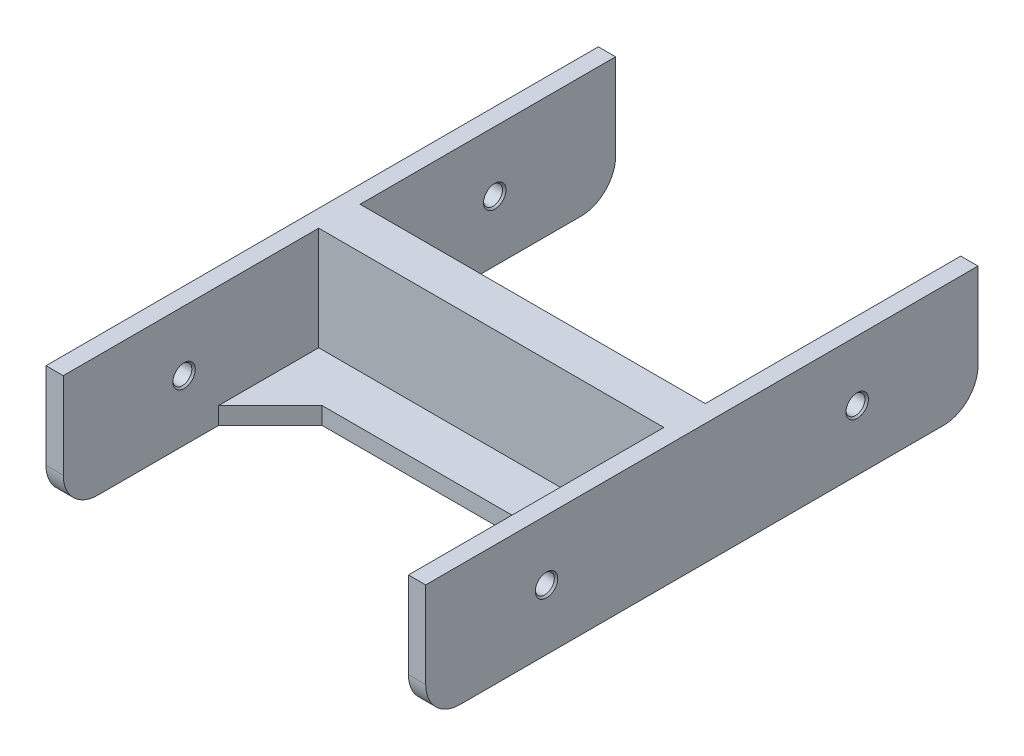
ISO-10303-21;
HEADER;
FILE_DESCRIPTION(('STEP AP214'),'2;1');
FILE_NAME('part.step','',(''),(''),'','','');
FILE_SCHEMA(('AUTOMOTIVE_DESIGN { 1 0 10303 214 1 1 1 1 }'));
ENDSEC;
DATA;
#1=APPLICATION_CONTEXT('core data for automotive mechanical design processes');
#2=APPLICATION_PROTOCOL_DEFINITION('international standard','automotive_design',2000,#1);
#3=PRODUCT_CONTEXT('',#1,'mechanical');
#4=PRODUCT('Part','Part','',(#3));
#5=PRODUCT_RELATED_PRODUCT_CATEGORY('part','',(#4));
#6=PRODUCT_DEFINITION_FORMATION('','',#4);
#7=PRODUCT_DEFINITION_CONTEXT('part definition',#1,'design');
#8=PRODUCT_DEFINITION('design','',#6,#7);
#9=PRODUCT_DEFINITION_SHAPE('','',#8);
#10=(LENGTH_UNIT() NAMED_UNIT(*) SI_UNIT(.MILLI.,.METRE.));
#11=(NAMED_UNIT(*) PLANE_ANGLE_UNIT() SI_UNIT($,.RADIAN.));
#12=(NAMED_UNIT(*) SI_UNIT($,.STERADIAN.) SOLID_ANGLE_UNIT());
#13=UNCERTAINTY_MEASURE_WITH_UNIT(LENGTH_MEASURE(1.E-05),#10,'distance_accuracy_value','');
#14=(GEOMETRIC_REPRESENTATION_CONTEXT(3) GLOBAL_UNCERTAINTY_ASSIGNED_CONTEXT((#13)) GLOBAL_UNIT_ASSIGNED_CONTEXT((#10,
#11,#12)) REPRESENTATION_CONTEXT('',''));
#15=CARTESIAN_POINT('',(0.,0.,0.));
#16=DIRECTION('',(0.,0.,1.));
#17=DIRECTION('',(1.,0.,0.));
#18=AXIS2_PLACEMENT_3D('',#15,#16,#17);
#19=CARTESIAN_POINT('',(105.,-10.,6.));
#20=DIRECTION('',(0.,0.,-1.));
#21=DIRECTION('',(-1.,0.,0.));
#22=AXIS2_PLACEMENT_3D('',#19,#20,#21);
#23=PLANE('',#22);
#24=DIRECTION('',(-1.,0.,0.));
#25=VECTOR('',#24,1.);
#26=CARTESIAN_POINT('',(105.,20.,6.));
#27=LINE('',#26,#25);
#28=CARTESIAN_POINT('',(105.,20.,6.));
#29=VERTEX_POINT('',#28);
#30=CARTESIAN_POINT('',(5.,20.,6.));
#31=VERTEX_POINT('',#30);
#32=EDGE_CURVE('E302',#29,#31,#27,.T.);
#33=ORIENTED_EDGE('',*,*,#32,.T.);
#34=DIRECTION('',(0.,-1.,0.));
#35=VECTOR('',#34,1.);
#36=CARTESIAN_POINT('',(5.,-10.,6.));
#37=LINE('',#36,#35);
#38=CARTESIAN_POINT('',(5.,-10.,6.));
#39=VERTEX_POINT('',#38);
#40=EDGE_CURVE('E306',#31,#39,#37,.T.);
#41=ORIENTED_EDGE('',*,*,#40,.T.);
#42=DIRECTION('',(-1.,0.,0.));
#43=VECTOR('',#42,1.);
#44=CARTESIAN_POINT('',(105.,-10.,6.));
#45=LINE('',#44,#43);
#46=CARTESIAN_POINT('',(105.,-10.,6.));
#47=VERTEX_POINT('',#46);
#48=EDGE_CURVE('E336',#47,#39,#45,.T.);
#49=ORIENTED_EDGE('',*,*,#48,.F.);
#50=DIRECTION('',(0.,-1.,0.));
#51=VECTOR('',#50,1.);
#52=CARTESIAN_POINT('',(105.,-10.,6.));
#53=LINE('',#52,#51);
#54=EDGE_CURVE('E309',#29,#47,#53,.T.);
#55=ORIENTED_EDGE('',*,*,#54,.F.);
#56=EDGE_LOOP('',(#33,#41,#49,#55));
#57=FACE_BOUND('',#56,.T.);
#58=ADVANCED_FACE('F37',(#57),#23,.F.);
#59=CARTESIAN_POINT('',(5.,0.,0.));
#60=DIRECTION('',(1.,0.,0.));
#61=DIRECTION('',(0.,0.,-1.));
#62=AXIS2_PLACEMENT_3D('',#59,#60,#61);
#63=PLANE('',#62);
#64=CARTESIAN_POINT('',(5.,2.49999999999999,-45.));
#65=DIRECTION('',(1.,0.,0.));
#66=DIRECTION('',(0.,0.,-1.));
#67=AXIS2_PLACEMENT_3D('',#64,#65,#66);
#68=CIRCLE('',#67,3.24999999999995);
#69=CARTESIAN_POINT('',(5.,2.49999999999999,-48.2499999999999));
#70=VERTEX_POINT('',#69);
#71=EDGE_CURVE('E374',#70,#70,#68,.F.);
#72=ORIENTED_EDGE('',*,*,#71,.T.);
#73=EDGE_LOOP('',(#72));
#74=FACE_BOUND('',#73,.T.);
#75=DIRECTION('',(0.,0.,-1.));
#76=VECTOR('',#75,1.);
#77=CARTESIAN_POINT('',(5.,-15.,80.));
#78=LINE('',#77,#76);
#79=CARTESIAN_POINT('',(5.,-15.,-35.));
#80=VERTEX_POINT('',#79);
#81=CARTESIAN_POINT('',(5.,-15.,-70.));
#82=VERTEX_POINT('',#81);
#83=EDGE_CURVE('E342',#80,#82,#78,.T.);
#84=ORIENTED_EDGE('',*,*,#83,.T.);
#85=CARTESIAN_POINT('',(5.,-5.,-70.));
#86=DIRECTION('',(1.,0.,0.));
#87=DIRECTION('',(0.,0.,-1.));
#88=AXIS2_PLACEMENT_3D('',#85,#86,#87);
#89=CIRCLE('',#88,10.);
#90=CARTESIAN_POINT('',(5.,-5.,-80.));
#91=VERTEX_POINT('',#90);
#92=EDGE_CURVE('E11',#82,#91,#89,.T.);
#93=ORIENTED_EDGE('',*,*,#92,.T.);
#94=DIRECTION('',(0.,1.,0.));
#95=VECTOR('',#94,1.);
#96=CARTESIAN_POINT('',(5.,5.,-80.));
#97=LINE('',#96,#95);
#98=CARTESIAN_POINT('',(5.,20.,-80.));
#99=VERTEX_POINT('',#98);
#100=EDGE_CURVE('E346',#91,#99,#97,.T.);
#101=ORIENTED_EDGE('',*,*,#100,.T.);
#102=DIRECTION('',(0.,0.,-1.));
#103=VECTOR('',#102,1.);
#104=CARTESIAN_POINT('',(5.,20.,-6.));
#105=LINE('',#104,#103);
#106=CARTESIAN_POINT('',(5.,20.,-6.));
#107=VERTEX_POINT('',#106);
#108=EDGE_CURVE('E287',#107,#99,#105,.T.);
#109=ORIENTED_EDGE('',*,*,#108,.F.);
#110=DIRECTION('',(0.,1.,0.));
#111=VECTOR('',#110,1.);
#112=CARTESIAN_POINT('',(5.,5.,-6.));
#113=LINE('',#112,#111);
#114=CARTESIAN_POINT('',(5.,-9.99999999999999,-6.));
#115=VERTEX_POINT('',#114);
#116=EDGE_CURVE('E203',#115,#107,#113,.T.);
#117=ORIENTED_EDGE('',*,*,#116,.F.);
#118=DIRECTION('',(0.,0.,1.));
#119=VECTOR('',#118,1.);
#120=CARTESIAN_POINT('',(5.,-9.99999999999999,-6.));
#121=LINE('',#120,#119);
#122=CARTESIAN_POINT('',(5.,-10.,-35.));
#123=VERTEX_POINT('',#122);
#124=EDGE_CURVE('E197',#123,#115,#121,.T.);
#125=ORIENTED_EDGE('',*,*,#124,.F.);
#126=DIRECTION('',(0.,-1.,0.));
#127=VECTOR('',#126,1.);
#128=CARTESIAN_POINT('',(5.,-10.,-35.));
#129=LINE('',#128,#127);
#130=EDGE_CURVE('E200',#123,#80,#129,.T.);
#131=ORIENTED_EDGE('',*,*,#130,.T.);
#132=EDGE_LOOP('',(#84,#93,#101,#109,#117,#125,#131));
#133=FACE_BOUND('',#132,.T.);
#134=ADVANCED_FACE('F199',(#74,#133),#63,.T.);
#135=CARTESIAN_POINT('',(5.,5.,80.));
#136=DIRECTION('',(0.,0.,-1.));
#137=DIRECTION('',(-1.,0.,0.));
#138=AXIS2_PLACEMENT_3D('',#135,#136,#137);
#139=PLANE('',#138);
#140=DIRECTION('',(0.,-1.,0.));
#141=VECTOR('',#140,1.);
#142=CARTESIAN_POINT('',(0.,5.,80.));
#143=LINE('',#142,#141);
#144=CARTESIAN_POINT('',(0.,20.,80.));
#145=VERTEX_POINT('',#144);
#146=CARTESIAN_POINT('',(0.,-5.,80.));
#147=VERTEX_POINT('',#146);
#148=EDGE_CURVE('E339',#145,#147,#143,.T.);
#149=ORIENTED_EDGE('',*,*,#148,.T.);
#150=DIRECTION('',(-1.,0.,0.));
#151=VECTOR('',#150,1.);
#152=CARTESIAN_POINT('',(5.,-5.,80.));
#153=LINE('',#152,#151);
#154=CARTESIAN_POINT('',(5.,-5.,80.));
#155=VERTEX_POINT('',#154);
#156=EDGE_CURVE('E58',#147,#155,#153,.F.);
#157=ORIENTED_EDGE('',*,*,#156,.T.);
#158=DIRECTION('',(0.,-1.,0.));
#159=VECTOR('',#158,1.);
#160=CARTESIAN_POINT('',(5.,5.,80.));
#161=LINE('',#160,#159);
#162=CARTESIAN_POINT('',(5.,20.,80.));
#163=VERTEX_POINT('',#162);
#164=EDGE_CURVE('E340',#163,#155,#161,.T.);
#165=ORIENTED_EDGE('',*,*,#164,.F.);
#166=DIRECTION('',(-1.,0.,0.));
#167=VECTOR('',#166,1.);
#168=CARTESIAN_POINT('',(5.,20.,80.));
#169=LINE('',#168,#167);
#170=EDGE_CURVE('E296',#163,#145,#169,.T.);
#171=ORIENTED_EDGE('',*,*,#170,.T.);
#172=EDGE_LOOP('',(#149,#157,#165,#171));
#173=FACE_BOUND('',#172,.T.);
#174=ADVANCED_FACE('F475',(#173),#139,.F.);
#175=CARTESIAN_POINT('',(5.,-15.,80.));
#176=DIRECTION('',(0.,1.,0.));
#177=DIRECTION('',(0.,0.,1.));
#178=AXIS2_PLACEMENT_3D('',#175,#176,#177);
#179=PLANE('',#178);
#180=DIRECTION('',(0.,0.,-1.));
#181=VECTOR('',#180,1.);
#182=CARTESIAN_POINT('',(105.,-15.,80.));
#183=LINE('',#182,#181);
#184=CARTESIAN_POINT('',(105.,-15.,-35.));
#185=VERTEX_POINT('',#184);
#186=CARTESIAN_POINT('',(105.,-15.,-70.));
#187=VERTEX_POINT('',#186);
#188=EDGE_CURVE('E274',#185,#187,#183,.T.);
#189=ORIENTED_EDGE('',*,*,#188,.T.);
#190=DIRECTION('',(-1.,0.,0.));
#191=VECTOR('',#190,1.);
#192=CARTESIAN_POINT('',(5.,-15.,-70.));
#193=LINE('',#192,#191);
#194=CARTESIAN_POINT('',(110.,-15.,-70.));
#195=VERTEX_POINT('',#194);
#196=EDGE_CURVE('E414',#187,#195,#193,.F.);
#197=ORIENTED_EDGE('',*,*,#196,.T.);
#198=DIRECTION('',(0.,0.,-1.));
#199=VECTOR('',#198,1.);
#200=CARTESIAN_POINT('',(110.,-15.,80.));
#201=LINE('',#200,#199);
#202=CARTESIAN_POINT('',(110.,-15.,70.));
#203=VERTEX_POINT('',#202);
#204=EDGE_CURVE('E263',#203,#195,#201,.T.);
#205=ORIENTED_EDGE('',*,*,#204,.F.);
#206=DIRECTION('',(-1.,0.,0.));
#207=VECTOR('',#206,1.);
#208=CARTESIAN_POINT('',(5.,-15.,70.));
#209=LINE('',#208,#207);
#210=CARTESIAN_POINT('',(105.,-15.,70.));
#211=VERTEX_POINT('',#210);
#212=EDGE_CURVE('E411',#203,#211,#209,.T.);
#213=ORIENTED_EDGE('',*,*,#212,.T.);
#214=CARTESIAN_POINT('',(105.,-15.,35.));
#215=VERTEX_POINT('',#214);
#216=EDGE_CURVE('E275',#211,#215,#183,.T.);
#217=ORIENTED_EDGE('',*,*,#216,.T.);
#218=DIRECTION('',(-0.707106781186547,0.,-0.707106781186548));
#219=VECTOR('',#218,1.);
#220=CARTESIAN_POINT('',(90.,-15.,20.));
#221=LINE('',#220,#219);
#222=CARTESIAN_POINT('',(90.,-15.,20.));
#223=VERTEX_POINT('',#222);
#224=EDGE_CURVE('E247',#215,#223,#221,.T.);
#225=ORIENTED_EDGE('',*,*,#224,.T.);
#226=DIRECTION('',(-1.,0.,0.));
#227=VECTOR('',#226,1.);
#228=CARTESIAN_POINT('',(105.,-15.,20.));
#229=LINE('',#228,#227);
#230=CARTESIAN_POINT('',(20.,-15.,20.));
#231=VERTEX_POINT('',#230);
#232=EDGE_CURVE('E330',#223,#231,#229,.T.);
#233=ORIENTED_EDGE('',*,*,#232,.T.);
#234=DIRECTION('',(-0.707106781186547,0.,0.707106781186548));
#235=VECTOR('',#234,1.);
#236=CARTESIAN_POINT('',(20.,-15.,20.));
#237=LINE('',#236,#235);
#238=CARTESIAN_POINT('',(5.,-15.,35.));
#239=VERTEX_POINT('',#238);
#240=EDGE_CURVE('E225',#231,#239,#237,.T.);
#241=ORIENTED_EDGE('',*,*,#240,.T.);
#242=CARTESIAN_POINT('',(5.,-15.,70.));
#243=VERTEX_POINT('',#242);
#244=EDGE_CURVE('E344',#243,#239,#78,.T.);
#245=ORIENTED_EDGE('',*,*,#244,.F.);
#246=DIRECTION('',(-1.,0.,0.));
#247=VECTOR('',#246,1.);
#248=CARTESIAN_POINT('',(5.,-15.,70.));
#249=LINE('',#248,#247);
#250=CARTESIAN_POINT('',(0.,-15.,70.));
#251=VERTEX_POINT('',#250);
#252=EDGE_CURVE('E408',#243,#251,#249,.T.);
#253=ORIENTED_EDGE('',*,*,#252,.T.);
#254=DIRECTION('',(0.,0.,-1.));
#255=VECTOR('',#254,1.);
#256=CARTESIAN_POINT('',(0.,-15.,80.));
#257=LINE('',#256,#255);
#258=CARTESIAN_POINT('',(0.,-15.,-70.));
#259=VERTEX_POINT('',#258);
#260=EDGE_CURVE('E350',#251,#259,#257,.T.);
#261=ORIENTED_EDGE('',*,*,#260,.T.);
#262=DIRECTION('',(-1.,0.,0.));
#263=VECTOR('',#262,1.);
#264=CARTESIAN_POINT('',(5.,-15.,-70.));
#265=LINE('',#264,#263);
#266=EDGE_CURVE('E406',#259,#82,#265,.F.);
#267=ORIENTED_EDGE('',*,*,#266,.T.);
#268=ORIENTED_EDGE('',*,*,#83,.F.);
#269=DIRECTION('',(0.707106781186547,0.,0.707106781186548));
#270=VECTOR('',#269,1.);
#271=CARTESIAN_POINT('',(20.,-15.,-20.));
#272=LINE('',#271,#270);
#273=CARTESIAN_POINT('',(20.,-15.,-20.));
#274=VERTEX_POINT('',#273);
#275=EDGE_CURVE('E214',#80,#274,#272,.T.);
#276=ORIENTED_EDGE('',*,*,#275,.T.);
#277=DIRECTION('',(-1.,0.,0.));
#278=VECTOR('',#277,1.);
#279=CARTESIAN_POINT('',(105.,-15.,-20.));
#280=LINE('',#279,#278);
#281=CARTESIAN_POINT('',(90.,-15.,-20.));
#282=VERTEX_POINT('',#281);
#283=EDGE_CURVE('E327',#282,#274,#280,.T.);
#284=ORIENTED_EDGE('',*,*,#283,.F.);
#285=DIRECTION('',(0.707106781186547,0.,-0.707106781186548));
#286=VECTOR('',#285,1.);
#287=CARTESIAN_POINT('',(90.,-15.,-20.));
#288=LINE('',#287,#286);
#289=EDGE_CURVE('E236',#282,#185,#288,.T.);
#290=ORIENTED_EDGE('',*,*,#289,.T.);
#291=EDGE_LOOP('',(#189,#197,#205,#213,#217,#225,#233,#241,#245,#253,#261,#267,#268,#276,#284,#290));
#292=FACE_BOUND('',#291,.T.);
#293=ADVANCED_FACE('F460',(#292),#179,.F.);
#294=CARTESIAN_POINT('',(5.,5.,-80.));
#295=DIRECTION('',(0.,0.,1.));
#296=DIRECTION('',(1.,0.,0.));
#297=AXIS2_PLACEMENT_3D('',#294,#295,#296);
#298=PLANE('',#297);
#299=ORIENTED_EDGE('',*,*,#100,.F.);
#300=DIRECTION('',(-1.,0.,0.));
#301=VECTOR('',#300,1.);
#302=CARTESIAN_POINT('',(5.,-5.,-80.));
#303=LINE('',#302,#301);
#304=CARTESIAN_POINT('',(0.,-5.,-80.));
#305=VERTEX_POINT('',#304);
#306=EDGE_CURVE('E45',#91,#305,#303,.T.);
#307=ORIENTED_EDGE('',*,*,#306,.T.);
#308=DIRECTION('',(0.,1.,0.));
#309=VECTOR('',#308,1.);
#310=CARTESIAN_POINT('',(0.,5.,-80.));
#311=LINE('',#310,#309);
#312=CARTESIAN_POINT('',(0.,20.,-80.));
#313=VERTEX_POINT('',#312);
#314=EDGE_CURVE('E343',#305,#313,#311,.T.);
#315=ORIENTED_EDGE('',*,*,#314,.T.);
#316=DIRECTION('',(-1.,0.,0.));
#317=VECTOR('',#316,1.);
#318=CARTESIAN_POINT('',(5.,20.,-80.));
#319=LINE('',#318,#317);
#320=EDGE_CURVE('E290',#99,#313,#319,.T.);
#321=ORIENTED_EDGE('',*,*,#320,.F.);
#322=EDGE_LOOP('',(#299,#307,#315,#321));
#323=FACE_BOUND('',#322,.T.);
#324=ADVANCED_FACE('F434',(#323),#298,.F.);
#325=CARTESIAN_POINT('',(5.,2.49999999999998,45.));
#326=DIRECTION('',(1.,0.,0.));
#327=DIRECTION('',(0.,0.,-1.));
#328=AXIS2_PLACEMENT_3D('',#325,#326,#327);
#329=CIRCLE('',#328,3.24999999999995);
#330=CARTESIAN_POINT('',(5.,2.49999999999998,41.75));
#331=VERTEX_POINT('',#330);
#332=EDGE_CURVE('E365',#331,#331,#329,.F.);
#333=ORIENTED_EDGE('',*,*,#332,.T.);
#334=EDGE_LOOP('',(#333));
#335=FACE_BOUND('',#334,.T.);
#336=ORIENTED_EDGE('',*,*,#164,.T.);
#337=CARTESIAN_POINT('',(5.,-5.,70.));
#338=DIRECTION('',(1.,0.,0.));
#339=DIRECTION('',(0.,0.,-1.));
#340=AXIS2_PLACEMENT_3D('',#337,#338,#339);
#341=CIRCLE('',#340,10.);
#342=EDGE_CURVE('E429',#155,#243,#341,.T.);
#343=ORIENTED_EDGE('',*,*,#342,.T.);
#344=ORIENTED_EDGE('',*,*,#244,.T.);
#345=DIRECTION('',(0.,-1.,0.));
#346=VECTOR('',#345,1.);
#347=CARTESIAN_POINT('',(5.,-10.,35.));
#348=LINE('',#347,#346);
#349=CARTESIAN_POINT('',(5.,-10.,35.));
#350=VERTEX_POINT('',#349);
#351=EDGE_CURVE('E233',#350,#239,#348,.T.);
#352=ORIENTED_EDGE('',*,*,#351,.F.);
#353=DIRECTION('',(0.,0.,1.));
#354=VECTOR('',#353,1.);
#355=CARTESIAN_POINT('',(5.,-10.,20.));
#356=LINE('',#355,#354);
#357=EDGE_CURVE('E207',#39,#350,#356,.T.);
#358=ORIENTED_EDGE('',*,*,#357,.F.);
#359=ORIENTED_EDGE('',*,*,#40,.F.);
#360=DIRECTION('',(0.,0.,-1.));
#361=VECTOR('',#360,1.);
#362=CARTESIAN_POINT('',(5.,20.,6.));
#363=LINE('',#362,#361);
#364=EDGE_CURVE('E293',#163,#31,#363,.T.);
#365=ORIENTED_EDGE('',*,*,#364,.F.);
#366=EDGE_LOOP('',(#336,#343,#344,#352,#358,#359,#365));
#367=FACE_BOUND('',#366,.T.);
#368=ADVANCED_FACE('F478',(#335,#367),#63,.T.);
#369=CARTESIAN_POINT('',(0.,0.,0.));
#370=DIRECTION('',(1.,0.,0.));
#371=DIRECTION('',(0.,0.,-1.));
#372=AXIS2_PLACEMENT_3D('',#369,#370,#371);
#373=PLANE('',#372);
#374=CARTESIAN_POINT('',(0.,2.49999999999998,45.));
#375=DIRECTION('',(1.,0.,0.));
#376=DIRECTION('',(0.,0.,-1.));
#377=AXIS2_PLACEMENT_3D('',#374,#375,#376);
#378=CIRCLE('',#377,3.25);
#379=CARTESIAN_POINT('',(0.,2.49999999999998,41.75));
#380=VERTEX_POINT('',#379);
#381=EDGE_CURVE('E356',#380,#380,#378,.T.);
#382=ORIENTED_EDGE('',*,*,#381,.T.);
#383=EDGE_LOOP('',(#382));
#384=FACE_BOUND('',#383,.T.);
#385=CARTESIAN_POINT('',(0.,2.49999999999999,-45.));
#386=DIRECTION('',(1.,0.,0.));
#387=DIRECTION('',(0.,0.,-1.));
#388=AXIS2_PLACEMENT_3D('',#385,#386,#387);
#389=CIRCLE('',#388,3.25);
#390=CARTESIAN_POINT('',(0.,2.49999999999999,-48.25));
#391=VERTEX_POINT('',#390);
#392=EDGE_CURVE('E348',#391,#391,#389,.T.);
#393=ORIENTED_EDGE('',*,*,#392,.T.);
#394=EDGE_LOOP('',(#393));
#395=FACE_BOUND('',#394,.T.);
#396=ORIENTED_EDGE('',*,*,#260,.F.);
#397=CARTESIAN_POINT('',(0.,-5.,70.));
#398=DIRECTION('',(1.,0.,0.));
#399=DIRECTION('',(0.,0.,-1.));
#400=AXIS2_PLACEMENT_3D('',#397,#398,#399);
#401=CIRCLE('',#400,10.);
#402=EDGE_CURVE('E426',#251,#147,#401,.F.);
#403=ORIENTED_EDGE('',*,*,#402,.T.);
#404=ORIENTED_EDGE('',*,*,#148,.F.);
#405=DIRECTION('',(0.,0.,-1.));
#406=VECTOR('',#405,1.);
#407=CARTESIAN_POINT('',(0.,20.,6.));
#408=LINE('',#407,#406);
#409=EDGE_CURVE('E299',#145,#313,#408,.T.);
#410=ORIENTED_EDGE('',*,*,#409,.T.);
#411=ORIENTED_EDGE('',*,*,#314,.F.);
#412=CARTESIAN_POINT('',(0.,-5.,-70.));
#413=DIRECTION('',(1.,0.,0.));
#414=DIRECTION('',(0.,0.,-1.));
#415=AXIS2_PLACEMENT_3D('',#412,#413,#414);
#416=CIRCLE('',#415,10.);
#417=EDGE_CURVE('E424',#305,#259,#416,.F.);
#418=ORIENTED_EDGE('',*,*,#417,.T.);
#419=EDGE_LOOP('',(#396,#403,#404,#410,#411,#418));
#420=FACE_BOUND('',#419,.T.);
#421=ADVANCED_FACE('F439',(#384,#395,#420),#373,.F.);
#422=CARTESIAN_POINT('',(105.,-10.,20.));
#423=DIRECTION('',(0.,-1.,0.));
#424=DIRECTION('',(0.,0.,-1.));
#425=AXIS2_PLACEMENT_3D('',#422,#423,#424);
#426=PLANE('',#425);
#427=ORIENTED_EDGE('',*,*,#357,.T.);
#428=DIRECTION('',(-0.707106781186547,0.,0.707106781186548));
#429=VECTOR('',#428,1.);
#430=CARTESIAN_POINT('',(20.,-10.,20.));
#431=LINE('',#430,#429);
#432=CARTESIAN_POINT('',(20.,-10.,20.));
#433=VERTEX_POINT('',#432);
#434=EDGE_CURVE('E227',#433,#350,#431,.T.);
#435=ORIENTED_EDGE('',*,*,#434,.F.);
#436=DIRECTION('',(-1.,0.,0.));
#437=VECTOR('',#436,1.);
#438=CARTESIAN_POINT('',(105.,-10.,20.));
#439=LINE('',#438,#437);
#440=CARTESIAN_POINT('',(90.,-10.,20.));
#441=VERTEX_POINT('',#440);
#442=EDGE_CURVE('E333',#441,#433,#439,.T.);
#443=ORIENTED_EDGE('',*,*,#442,.F.);
#444=DIRECTION('',(-0.707106781186547,0.,-0.707106781186548));
#445=VECTOR('',#444,1.);
#446=CARTESIAN_POINT('',(90.,-10.,20.));
#447=LINE('',#446,#445);
#448=CARTESIAN_POINT('',(105.,-10.,35.));
#449=VERTEX_POINT('',#448);
#450=EDGE_CURVE('E250',#449,#441,#447,.T.);
#451=ORIENTED_EDGE('',*,*,#450,.F.);
#452=DIRECTION('',(0.,0.,1.));
#453=VECTOR('',#452,1.);
#454=CARTESIAN_POINT('',(105.,-10.,20.));
#455=LINE('',#454,#453);
#456=EDGE_CURVE('E312',#47,#449,#455,.T.);
#457=ORIENTED_EDGE('',*,*,#456,.F.);
#458=ORIENTED_EDGE('',*,*,#48,.T.);
#459=EDGE_LOOP('',(#427,#435,#443,#451,#457,#458));
#460=FACE_BOUND('',#459,.T.);
#461=ADVANCED_FACE('F480',(#460),#426,.F.);
#462=CARTESIAN_POINT('',(105.,-15.,20.));
#463=DIRECTION('',(0.,0.,-1.));
#464=DIRECTION('',(0.,1.,0.));
#465=AXIS2_PLACEMENT_3D('',#462,#463,#464);
#466=PLANE('',#465);
#467=ORIENTED_EDGE('',*,*,#442,.T.);
#468=DIRECTION('',(0.,-1.,0.));
#469=VECTOR('',#468,1.);
#470=CARTESIAN_POINT('',(20.,-10.,20.));
#471=LINE('',#470,#469);
#472=EDGE_CURVE('E230',#433,#231,#471,.T.);
#473=ORIENTED_EDGE('',*,*,#472,.T.);
#474=ORIENTED_EDGE('',*,*,#232,.F.);
#475=DIRECTION('',(0.,-1.,0.));
#476=VECTOR('',#475,1.);
#477=CARTESIAN_POINT('',(90.,-10.,20.));
#478=LINE('',#477,#476);
#479=EDGE_CURVE('E255',#441,#223,#478,.T.);
#480=ORIENTED_EDGE('',*,*,#479,.F.);
#481=EDGE_LOOP('',(#467,#473,#474,#480));
#482=FACE_BOUND('',#481,.T.);
#483=ADVANCED_FACE('F592',(#482),#466,.F.);
#484=CARTESIAN_POINT('',(105.,-9.99999999999999,-20.));
#485=DIRECTION('',(0.,0.,1.));
#486=DIRECTION('',(0.,-1.,0.));
#487=AXIS2_PLACEMENT_3D('',#484,#485,#486);
#488=PLANE('',#487);
#489=ORIENTED_EDGE('',*,*,#283,.T.);
#490=DIRECTION('',(0.,-1.,0.));
#491=VECTOR('',#490,1.);
#492=CARTESIAN_POINT('',(20.,-10.,-20.));
#493=LINE('',#492,#491);
#494=CARTESIAN_POINT('',(20.,-10.,-20.));
#495=VERTEX_POINT('',#494);
#496=EDGE_CURVE('E215',#495,#274,#493,.T.);
#497=ORIENTED_EDGE('',*,*,#496,.F.);
#498=DIRECTION('',(-1.,0.,0.));
#499=VECTOR('',#498,1.);
#500=CARTESIAN_POINT('',(105.,-9.99999999999999,-20.));
#501=LINE('',#500,#499);
#502=CARTESIAN_POINT('',(90.,-10.,-20.));
#503=VERTEX_POINT('',#502);
#504=EDGE_CURVE('E221',#503,#495,#501,.T.);
#505=ORIENTED_EDGE('',*,*,#504,.F.);
#506=DIRECTION('',(0.,-1.,0.));
#507=VECTOR('',#506,1.);
#508=CARTESIAN_POINT('',(90.,-10.,-20.));
#509=LINE('',#508,#507);
#510=EDGE_CURVE('E242',#503,#282,#509,.T.);
#511=ORIENTED_EDGE('',*,*,#510,.T.);
#512=EDGE_LOOP('',(#489,#497,#505,#511));
#513=FACE_BOUND('',#512,.T.);
#514=ADVANCED_FACE('F457',(#513),#488,.F.);
#515=CARTESIAN_POINT('',(105.,-9.99999999999999,-6.));
#516=DIRECTION('',(0.,-1.,0.));
#517=DIRECTION('',(0.,0.,-1.));
#518=AXIS2_PLACEMENT_3D('',#515,#516,#517);
#519=PLANE('',#518);
#520=ORIENTED_EDGE('',*,*,#124,.T.);
#521=DIRECTION('',(-1.,0.,0.));
#522=VECTOR('',#521,1.);
#523=CARTESIAN_POINT('',(105.,-9.99999999999999,-6.));
#524=LINE('',#523,#522);
#525=CARTESIAN_POINT('',(105.,-9.99999999999999,-6.));
#526=VERTEX_POINT('',#525);
#527=EDGE_CURVE('E320',#526,#115,#524,.T.);
#528=ORIENTED_EDGE('',*,*,#527,.F.);
#529=DIRECTION('',(0.,0.,1.));
#530=VECTOR('',#529,1.);
#531=CARTESIAN_POINT('',(105.,-9.99999999999999,-6.));
#532=LINE('',#531,#530);
#533=CARTESIAN_POINT('',(105.,-10.,-35.));
#534=VERTEX_POINT('',#533);
#535=EDGE_CURVE('E314',#534,#526,#532,.T.);
#536=ORIENTED_EDGE('',*,*,#535,.F.);
#537=DIRECTION('',(0.707106781186547,0.,-0.707106781186548));
#538=VECTOR('',#537,1.);
#539=CARTESIAN_POINT('',(90.,-10.,-20.));
#540=LINE('',#539,#538);
#541=EDGE_CURVE('E239',#503,#534,#540,.T.);
#542=ORIENTED_EDGE('',*,*,#541,.F.);
#543=ORIENTED_EDGE('',*,*,#504,.T.);
#544=DIRECTION('',(0.707106781186547,0.,0.707106781186548));
#545=VECTOR('',#544,1.);
#546=CARTESIAN_POINT('',(20.,-10.,-20.));
#547=LINE('',#546,#545);
#548=EDGE_CURVE('E211',#123,#495,#547,.T.);
#549=ORIENTED_EDGE('',*,*,#548,.F.);
#550=EDGE_LOOP('',(#520,#528,#536,#542,#543,#549));
#551=FACE_BOUND('',#550,.T.);
#552=ADVANCED_FACE('F218',(#551),#519,.F.);
#553=CARTESIAN_POINT('',(105.,5.,-6.));
#554=DIRECTION('',(0.,0.,1.));
#555=DIRECTION('',(0.,-1.,0.));
#556=AXIS2_PLACEMENT_3D('',#553,#554,#555);
#557=PLANE('',#556);
#558=ORIENTED_EDGE('',*,*,#116,.T.);
#559=DIRECTION('',(-1.,0.,0.));
#560=VECTOR('',#559,1.);
#561=CARTESIAN_POINT('',(105.,20.,-6.));
#562=LINE('',#561,#560);
#563=CARTESIAN_POINT('',(105.,20.,-6.00000000000001));
#564=VERTEX_POINT('',#563);
#565=EDGE_CURVE('E303',#564,#107,#562,.T.);
#566=ORIENTED_EDGE('',*,*,#565,.F.);
#567=DIRECTION('',(0.,1.,0.));
#568=VECTOR('',#567,1.);
#569=CARTESIAN_POINT('',(105.,5.,-6.));
#570=LINE('',#569,#568);
#571=EDGE_CURVE('E317',#526,#564,#570,.T.);
#572=ORIENTED_EDGE('',*,*,#571,.F.);
#573=ORIENTED_EDGE('',*,*,#527,.T.);
#574=EDGE_LOOP('',(#558,#566,#572,#573));
#575=FACE_BOUND('',#574,.T.);
#576=ADVANCED_FACE('F447',(#575),#557,.F.);
#577=CARTESIAN_POINT('',(105.,20.,6.));
#578=DIRECTION('',(0.,1.,0.));
#579=DIRECTION('',(0.,0.,1.));
#580=AXIS2_PLACEMENT_3D('',#577,#578,#579);
#581=PLANE('',#580);
#582=ORIENTED_EDGE('',*,*,#409,.F.);
#583=ORIENTED_EDGE('',*,*,#170,.F.);
#584=ORIENTED_EDGE('',*,*,#364,.T.);
#585=ORIENTED_EDGE('',*,*,#32,.F.);
#586=DIRECTION('',(0.,0.,1.));
#587=VECTOR('',#586,1.);
#588=CARTESIAN_POINT('',(105.,20.,80.));
#589=LINE('',#588,#587);
#590=CARTESIAN_POINT('',(105.,20.,80.));
#591=VERTEX_POINT('',#590);
#592=EDGE_CURVE('E279',#29,#591,#589,.T.);
#593=ORIENTED_EDGE('',*,*,#592,.T.);
#594=DIRECTION('',(-1.,0.,0.));
#595=VECTOR('',#594,1.);
#596=CARTESIAN_POINT('',(110.,20.,80.));
#597=LINE('',#596,#595);
#598=CARTESIAN_POINT('',(110.,20.,80.));
#599=VERTEX_POINT('',#598);
#600=EDGE_CURVE('E271',#599,#591,#597,.T.);
#601=ORIENTED_EDGE('',*,*,#600,.F.);
#602=DIRECTION('',(0.,0.,1.));
#603=VECTOR('',#602,1.);
#604=CARTESIAN_POINT('',(110.,20.,80.));
#605=LINE('',#604,#603);
#606=CARTESIAN_POINT('',(110.,20.,-80.));
#607=VERTEX_POINT('',#606);
#608=EDGE_CURVE('E269',#607,#599,#605,.T.);
#609=ORIENTED_EDGE('',*,*,#608,.F.);
#610=DIRECTION('',(-1.,0.,0.));
#611=VECTOR('',#610,1.);
#612=CARTESIAN_POINT('',(110.,20.,-80.));
#613=LINE('',#612,#611);
#614=CARTESIAN_POINT('',(105.,20.,-80.));
#615=VERTEX_POINT('',#614);
#616=EDGE_CURVE('E284',#607,#615,#613,.T.);
#617=ORIENTED_EDGE('',*,*,#616,.T.);
#618=EDGE_CURVE('E264',#615,#564,#589,.T.);
#619=ORIENTED_EDGE('',*,*,#618,.T.);
#620=ORIENTED_EDGE('',*,*,#565,.T.);
#621=ORIENTED_EDGE('',*,*,#108,.T.);
#622=ORIENTED_EDGE('',*,*,#320,.T.);
#623=EDGE_LOOP('',(#582,#583,#584,#585,#593,#601,#609,#617,#619,#620,#621,#622));
#624=FACE_BOUND('',#623,.T.);
#625=ADVANCED_FACE('F443',(#624),#581,.T.);
#626=CARTESIAN_POINT('',(105.,0.,0.));
#627=DIRECTION('',(-1.,0.,0.));
#628=DIRECTION('',(0.,0.,1.));
#629=AXIS2_PLACEMENT_3D('',#626,#627,#628);
#630=PLANE('',#629);
#631=CARTESIAN_POINT('',(105.,2.49999999999998,45.));
#632=DIRECTION('',(-1.,0.,0.));
#633=DIRECTION('',(0.,0.,1.));
#634=AXIS2_PLACEMENT_3D('',#631,#632,#633);
#635=CIRCLE('',#634,3.25);
#636=CARTESIAN_POINT('',(105.,2.49999999999998,48.25));
#637=VERTEX_POINT('',#636);
#638=EDGE_CURVE('E398',#637,#637,#635,.F.);
#639=ORIENTED_EDGE('',*,*,#638,.T.);
#640=EDGE_LOOP('',(#639));
#641=FACE_BOUND('',#640,.T.);
#642=ORIENTED_EDGE('',*,*,#216,.F.);
#643=CARTESIAN_POINT('',(105.,-5.,70.));
#644=DIRECTION('',(-1.,0.,0.));
#645=DIRECTION('',(0.,0.,1.));
#646=AXIS2_PLACEMENT_3D('',#643,#644,#645);
#647=CIRCLE('',#646,10.);
#648=CARTESIAN_POINT('',(105.,-5.,80.));
#649=VERTEX_POINT('',#648);
#650=EDGE_CURVE('E420',#211,#649,#647,.T.);
#651=ORIENTED_EDGE('',*,*,#650,.T.);
#652=DIRECTION('',(0.,-1.,0.));
#653=VECTOR('',#652,1.);
#654=CARTESIAN_POINT('',(105.,-15.,80.));
#655=LINE('',#654,#653);
#656=EDGE_CURVE('E257',#591,#649,#655,.T.);
#657=ORIENTED_EDGE('',*,*,#656,.F.);
#658=ORIENTED_EDGE('',*,*,#592,.F.);
#659=ORIENTED_EDGE('',*,*,#54,.T.);
#660=ORIENTED_EDGE('',*,*,#456,.T.);
#661=DIRECTION('',(0.,-1.,0.));
#662=VECTOR('',#661,1.);
#663=CARTESIAN_POINT('',(105.,-10.,35.));
#664=LINE('',#663,#662);
#665=EDGE_CURVE('E252',#449,#215,#664,.T.);
#666=ORIENTED_EDGE('',*,*,#665,.T.);
#667=EDGE_LOOP('',(#642,#651,#657,#658,#659,#660,#666));
#668=FACE_BOUND('',#667,.T.);
#669=ADVANCED_FACE('F582',(#641,#668),#630,.T.);
#670=CARTESIAN_POINT('',(110.,-15.,80.));
#671=DIRECTION('',(0.,0.,-1.));
#672=DIRECTION('',(-1.,0.,0.));
#673=AXIS2_PLACEMENT_3D('',#670,#671,#672);
#674=PLANE('',#673);
#675=ORIENTED_EDGE('',*,*,#656,.T.);
#676=DIRECTION('',(-1.,0.,0.));
#677=VECTOR('',#676,1.);
#678=CARTESIAN_POINT('',(110.,-5.,80.));
#679=LINE('',#678,#677);
#680=CARTESIAN_POINT('',(110.,-5.,80.));
#681=VERTEX_POINT('',#680);
#682=EDGE_CURVE('E422',#649,#681,#679,.F.);
#683=ORIENTED_EDGE('',*,*,#682,.T.);
#684=DIRECTION('',(0.,-1.,0.));
#685=VECTOR('',#684,1.);
#686=CARTESIAN_POINT('',(110.,-15.,80.));
#687=LINE('',#686,#685);
#688=EDGE_CURVE('E260',#599,#681,#687,.T.);
#689=ORIENTED_EDGE('',*,*,#688,.F.);
#690=ORIENTED_EDGE('',*,*,#600,.T.);
#691=EDGE_LOOP('',(#675,#683,#689,#690));
#692=FACE_BOUND('',#691,.T.);
#693=ADVANCED_FACE('F580',(#692),#674,.F.);
#694=CARTESIAN_POINT('',(110.,-15.,-80.));
#695=DIRECTION('',(0.,0.,1.));
#696=DIRECTION('',(1.,0.,0.));
#697=AXIS2_PLACEMENT_3D('',#694,#695,#696);
#698=PLANE('',#697);
#699=DIRECTION('',(0.,1.,0.));
#700=VECTOR('',#699,1.);
#701=CARTESIAN_POINT('',(110.,-15.,-80.));
#702=LINE('',#701,#700);
#703=CARTESIAN_POINT('',(110.,-5.,-80.));
#704=VERTEX_POINT('',#703);
#705=EDGE_CURVE('E267',#704,#607,#702,.T.);
#706=ORIENTED_EDGE('',*,*,#705,.F.);
#707=DIRECTION('',(-1.,0.,0.));
#708=VECTOR('',#707,1.);
#709=CARTESIAN_POINT('',(110.,-5.,-80.));
#710=LINE('',#709,#708);
#711=CARTESIAN_POINT('',(105.,-5.,-80.));
#712=VERTEX_POINT('',#711);
#713=EDGE_CURVE('E401',#704,#712,#710,.T.);
#714=ORIENTED_EDGE('',*,*,#713,.T.);
#715=DIRECTION('',(0.,1.,0.));
#716=VECTOR('',#715,1.);
#717=CARTESIAN_POINT('',(105.,-15.,-80.));
#718=LINE('',#717,#716);
#719=EDGE_CURVE('E277',#712,#615,#718,.T.);
#720=ORIENTED_EDGE('',*,*,#719,.T.);
#721=ORIENTED_EDGE('',*,*,#616,.F.);
#722=EDGE_LOOP('',(#706,#714,#720,#721));
#723=FACE_BOUND('',#722,.T.);
#724=ADVANCED_FACE('F573',(#723),#698,.F.);
#725=CARTESIAN_POINT('',(110.,0.,0.));
#726=DIRECTION('',(-1.,0.,0.));
#727=DIRECTION('',(0.,0.,1.));
#728=AXIS2_PLACEMENT_3D('',#725,#726,#727);
#729=PLANE('',#728);
#730=CARTESIAN_POINT('',(110.,2.49999999999999,-45.));
#731=DIRECTION('',(-1.,0.,0.));
#732=DIRECTION('',(0.,0.,1.));
#733=AXIS2_PLACEMENT_3D('',#730,#731,#732);
#734=CIRCLE('',#733,3.25000000000003);
#735=CARTESIAN_POINT('',(110.,2.49999999999999,-41.75));
#736=VERTEX_POINT('',#735);
#737=EDGE_CURVE('E386',#736,#736,#734,.T.);
#738=ORIENTED_EDGE('',*,*,#737,.T.);
#739=EDGE_LOOP('',(#738));
#740=FACE_BOUND('',#739,.T.);
#741=CARTESIAN_POINT('',(110.,2.49999999999998,45.));
#742=DIRECTION('',(-1.,0.,0.));
#743=DIRECTION('',(0.,0.,1.));
#744=AXIS2_PLACEMENT_3D('',#741,#742,#743);
#745=CIRCLE('',#744,3.25000000000003);
#746=CARTESIAN_POINT('',(110.,2.49999999999998,48.25));
#747=VERTEX_POINT('',#746);
#748=EDGE_CURVE('E383',#747,#747,#745,.T.);
#749=ORIENTED_EDGE('',*,*,#748,.T.);
#750=EDGE_LOOP('',(#749));
#751=FACE_BOUND('',#750,.T.);
#752=ORIENTED_EDGE('',*,*,#204,.T.);
#753=CARTESIAN_POINT('',(110.,-5.,-70.));
#754=DIRECTION('',(-1.,0.,0.));
#755=DIRECTION('',(0.,0.,1.));
#756=AXIS2_PLACEMENT_3D('',#753,#754,#755);
#757=CIRCLE('',#756,10.);
#758=EDGE_CURVE('E418',#195,#704,#757,.F.);
#759=ORIENTED_EDGE('',*,*,#758,.T.);
#760=ORIENTED_EDGE('',*,*,#705,.T.);
#761=ORIENTED_EDGE('',*,*,#608,.T.);
#762=ORIENTED_EDGE('',*,*,#688,.T.);
#763=CARTESIAN_POINT('',(110.,-5.,70.));
#764=DIRECTION('',(-1.,0.,0.));
#765=DIRECTION('',(0.,0.,1.));
#766=AXIS2_PLACEMENT_3D('',#763,#764,#765);
#767=CIRCLE('',#766,10.);
#768=EDGE_CURVE('E416',#681,#203,#767,.F.);
#769=ORIENTED_EDGE('',*,*,#768,.T.);
#770=EDGE_LOOP('',(#752,#759,#760,#761,#762,#769));
#771=FACE_BOUND('',#770,.T.);
#772=ADVANCED_FACE('F564',(#740,#751,#771),#729,.F.);
#773=CARTESIAN_POINT('',(105.,2.49999999999999,-45.));
#774=DIRECTION('',(-1.,0.,0.));
#775=DIRECTION('',(0.,0.,1.));
#776=AXIS2_PLACEMENT_3D('',#773,#774,#775);
#777=CIRCLE('',#776,3.25);
#778=CARTESIAN_POINT('',(105.,2.49999999999999,-41.75));
#779=VERTEX_POINT('',#778);
#780=EDGE_CURVE('E389',#779,#779,#777,.F.);
#781=ORIENTED_EDGE('',*,*,#780,.T.);
#782=EDGE_LOOP('',(#781));
#783=FACE_BOUND('',#782,.T.);
#784=ORIENTED_EDGE('',*,*,#719,.F.);
#785=CARTESIAN_POINT('',(105.,-5.,-70.));
#786=DIRECTION('',(-1.,0.,0.));
#787=DIRECTION('',(0.,0.,1.));
#788=AXIS2_PLACEMENT_3D('',#785,#786,#787);
#789=CIRCLE('',#788,10.);
#790=EDGE_CURVE('E404',#712,#187,#789,.T.);
#791=ORIENTED_EDGE('',*,*,#790,.T.);
#792=ORIENTED_EDGE('',*,*,#188,.F.);
#793=DIRECTION('',(0.,-1.,0.));
#794=VECTOR('',#793,1.);
#795=CARTESIAN_POINT('',(105.,-10.,-35.));
#796=LINE('',#795,#794);
#797=EDGE_CURVE('E244',#534,#185,#796,.T.);
#798=ORIENTED_EDGE('',*,*,#797,.F.);
#799=ORIENTED_EDGE('',*,*,#535,.T.);
#800=ORIENTED_EDGE('',*,*,#571,.T.);
#801=ORIENTED_EDGE('',*,*,#618,.F.);
#802=EDGE_LOOP('',(#784,#791,#792,#798,#799,#800,#801));
#803=FACE_BOUND('',#802,.T.);
#804=ADVANCED_FACE('F450',(#783,#803),#630,.T.);
#805=CARTESIAN_POINT('',(90.,-10.,20.));
#806=DIRECTION('',(-0.707106781186548,0.,0.707106781186547));
#807=DIRECTION('',(0.707106781186547,0.,0.707106781186548));
#808=AXIS2_PLACEMENT_3D('',#805,#806,#807);
#809=PLANE('',#808);
#810=ORIENTED_EDGE('',*,*,#224,.F.);
#811=ORIENTED_EDGE('',*,*,#665,.F.);
#812=ORIENTED_EDGE('',*,*,#450,.T.);
#813=ORIENTED_EDGE('',*,*,#479,.T.);
#814=EDGE_LOOP('',(#810,#811,#812,#813));
#815=FACE_BOUND('',#814,.T.);
#816=ADVANCED_FACE('F587',(#815),#809,.T.);
#817=CARTESIAN_POINT('',(90.,-10.,-20.));
#818=DIRECTION('',(-0.707106781186548,0.,-0.707106781186547));
#819=DIRECTION('',(-0.707106781186547,0.,0.707106781186548));
#820=AXIS2_PLACEMENT_3D('',#817,#818,#819);
#821=PLANE('',#820);
#822=ORIENTED_EDGE('',*,*,#289,.F.);
#823=ORIENTED_EDGE('',*,*,#510,.F.);
#824=ORIENTED_EDGE('',*,*,#541,.T.);
#825=ORIENTED_EDGE('',*,*,#797,.T.);
#826=EDGE_LOOP('',(#822,#823,#824,#825));
#827=FACE_BOUND('',#826,.T.);
#828=ADVANCED_FACE('F454',(#827),#821,.T.);
#829=CARTESIAN_POINT('',(20.,-10.,20.));
#830=DIRECTION('',(0.707106781186548,0.,0.707106781186547));
#831=DIRECTION('',(0.707106781186547,0.,-0.707106781186548));
#832=AXIS2_PLACEMENT_3D('',#829,#830,#831);
#833=PLANE('',#832);
#834=ORIENTED_EDGE('',*,*,#240,.F.);
#835=ORIENTED_EDGE('',*,*,#472,.F.);
#836=ORIENTED_EDGE('',*,*,#434,.T.);
#837=ORIENTED_EDGE('',*,*,#351,.T.);
#838=EDGE_LOOP('',(#834,#835,#836,#837));
#839=FACE_BOUND('',#838,.T.);
#840=ADVANCED_FACE('F597',(#839),#833,.T.);
#841=CARTESIAN_POINT('',(20.,-10.,-20.));
#842=DIRECTION('',(0.707106781186548,0.,-0.707106781186547));
#843=DIRECTION('',(-0.707106781186547,0.,-0.707106781186548));
#844=AXIS2_PLACEMENT_3D('',#841,#842,#843);
#845=PLANE('',#844);
#846=ORIENTED_EDGE('',*,*,#275,.F.);
#847=ORIENTED_EDGE('',*,*,#130,.F.);
#848=ORIENTED_EDGE('',*,*,#548,.T.);
#849=ORIENTED_EDGE('',*,*,#496,.T.);
#850=EDGE_LOOP('',(#846,#847,#848,#849));
#851=FACE_BOUND('',#850,.T.);
#852=ADVANCED_FACE('F210',(#851),#845,.T.);
#853=CARTESIAN_POINT('',(0.,2.49999999999999,-45.));
#854=DIRECTION('',(1.,0.,0.));
#855=DIRECTION('',(0.,0.,-1.));
#856=AXIS2_PLACEMENT_3D('',#853,#854,#855);
#857=CYLINDRICAL_SURFACE('',#856,2.74999999999999);
#858=CARTESIAN_POINT('',(109.5,2.49999999999999,-45.));
#859=DIRECTION('',(-1.,0.,0.));
#860=DIRECTION('',(0.,0.,1.));
#861=AXIS2_PLACEMENT_3D('',#858,#859,#860);
#862=CIRCLE('',#861,2.74999999999999);
#863=CARTESIAN_POINT('',(109.5,2.49999999999999,-42.25));
#864=VERTEX_POINT('',#863);
#865=EDGE_CURVE('E380',#864,#864,#862,.F.);
#866=ORIENTED_EDGE('',*,*,#865,.T.);
#867=EDGE_LOOP('',(#866));
#868=FACE_BOUND('',#867,.T.);
#869=CARTESIAN_POINT('',(105.5,2.49999999999999,-45.));
#870=DIRECTION('',(-1.,0.,0.));
#871=DIRECTION('',(0.,0.,1.));
#872=AXIS2_PLACEMENT_3D('',#869,#870,#871);
#873=CIRCLE('',#872,2.74999999999999);
#874=CARTESIAN_POINT('',(105.5,2.49999999999999,-42.25));
#875=VERTEX_POINT('',#874);
#876=EDGE_CURVE('E377',#875,#875,#873,.T.);
#877=ORIENTED_EDGE('',*,*,#876,.T.);
#878=EDGE_LOOP('',(#877));
#879=FACE_BOUND('',#878,.T.);
#880=ADVANCED_FACE('F610',(#868,#879),#857,.F.);
#881=CARTESIAN_POINT('',(0.,2.49999999999998,45.));
#882=DIRECTION('',(1.,0.,0.));
#883=DIRECTION('',(0.,0.,-1.));
#884=AXIS2_PLACEMENT_3D('',#881,#882,#883);
#885=CYLINDRICAL_SURFACE('',#884,2.74999999999999);
#886=CARTESIAN_POINT('',(109.5,2.49999999999998,45.));
#887=DIRECTION('',(-1.,0.,0.));
#888=DIRECTION('',(0.,0.,1.));
#889=AXIS2_PLACEMENT_3D('',#886,#887,#888);
#890=CIRCLE('',#889,2.74999999999999);
#891=CARTESIAN_POINT('',(109.5,2.49999999999998,47.75));
#892=VERTEX_POINT('',#891);
#893=EDGE_CURVE('E395',#892,#892,#890,.F.);
#894=ORIENTED_EDGE('',*,*,#893,.T.);
#895=EDGE_LOOP('',(#894));
#896=FACE_BOUND('',#895,.T.);
#897=CARTESIAN_POINT('',(105.5,2.49999999999998,45.));
#898=DIRECTION('',(-1.,0.,0.));
#899=DIRECTION('',(0.,0.,1.));
#900=AXIS2_PLACEMENT_3D('',#897,#898,#899);
#901=CIRCLE('',#900,2.74999999999999);
#902=CARTESIAN_POINT('',(105.5,2.49999999999998,47.75));
#903=VERTEX_POINT('',#902);
#904=EDGE_CURVE('E392',#903,#903,#901,.T.);
#905=ORIENTED_EDGE('',*,*,#904,.T.);
#906=EDGE_LOOP('',(#905));
#907=FACE_BOUND('',#906,.T.);
#908=ADVANCED_FACE('F736',(#896,#907),#885,.F.);
#909=CARTESIAN_POINT('',(0.49999999999999,2.49999999999998,45.));
#910=DIRECTION('',(1.,0.,0.));
#911=DIRECTION('',(0.,0.,-1.));
#912=AXIS2_PLACEMENT_3D('',#909,#910,#911);
#913=CIRCLE('',#912,2.74999999999999);
#914=CARTESIAN_POINT('',(0.49999999999999,2.49999999999998,42.25));
#915=VERTEX_POINT('',#914);
#916=EDGE_CURVE('E362',#915,#915,#913,.F.);
#917=ORIENTED_EDGE('',*,*,#916,.T.);
#918=EDGE_LOOP('',(#917));
#919=FACE_BOUND('',#918,.T.);
#920=CARTESIAN_POINT('',(4.50000000000004,2.49999999999998,45.));
#921=DIRECTION('',(1.,0.,0.));
#922=DIRECTION('',(0.,0.,-1.));
#923=AXIS2_PLACEMENT_3D('',#920,#921,#922);
#924=CIRCLE('',#923,2.74999999999999);
#925=CARTESIAN_POINT('',(4.50000000000004,2.49999999999998,42.25));
#926=VERTEX_POINT('',#925);
#927=EDGE_CURVE('E359',#926,#926,#924,.T.);
#928=ORIENTED_EDGE('',*,*,#927,.T.);
#929=EDGE_LOOP('',(#928));
#930=FACE_BOUND('',#929,.T.);
#931=ADVANCED_FACE('F726',(#919,#930),#885,.F.);
#932=CARTESIAN_POINT('',(0.49999999999999,2.49999999999999,-45.));
#933=DIRECTION('',(1.,0.,0.));
#934=DIRECTION('',(0.,0.,-1.));
#935=AXIS2_PLACEMENT_3D('',#932,#933,#934);
#936=CIRCLE('',#935,2.74999999999999);
#937=CARTESIAN_POINT('',(0.49999999999999,2.49999999999999,-47.75));
#938=VERTEX_POINT('',#937);
#939=EDGE_CURVE('E371',#938,#938,#936,.F.);
#940=ORIENTED_EDGE('',*,*,#939,.T.);
#941=EDGE_LOOP('',(#940));
#942=FACE_BOUND('',#941,.T.);
#943=CARTESIAN_POINT('',(4.50000000000004,2.49999999999999,-45.));
#944=DIRECTION('',(1.,0.,0.));
#945=DIRECTION('',(0.,0.,-1.));
#946=AXIS2_PLACEMENT_3D('',#943,#944,#945);
#947=CIRCLE('',#946,2.74999999999999);
#948=CARTESIAN_POINT('',(4.50000000000004,2.49999999999999,-47.75));
#949=VERTEX_POINT('',#948);
#950=EDGE_CURVE('E368',#949,#949,#947,.T.);
#951=ORIENTED_EDGE('',*,*,#950,.T.);
#952=EDGE_LOOP('',(#951));
#953=FACE_BOUND('',#952,.T.);
#954=ADVANCED_FACE('F502',(#942,#953),#857,.F.);
#955=CARTESIAN_POINT('',(0.,2.49999999999998,45.));
#956=DIRECTION('',(-1.,0.,0.));
#957=DIRECTION('',(0.,0.,1.));
#958=AXIS2_PLACEMENT_3D('',#955,#956,#957);
#959=CONICAL_SURFACE('',#958,3.25,0.785398163397466);
#960=ORIENTED_EDGE('',*,*,#916,.F.);
#961=EDGE_LOOP('',(#960));
#962=FACE_BOUND('',#961,.T.);
#963=ORIENTED_EDGE('',*,*,#381,.F.);
#964=EDGE_LOOP('',(#963));
#965=FACE_BOUND('',#964,.T.);
#966=ADVANCED_FACE('F495',(#962,#965),#959,.F.);
#967=CARTESIAN_POINT('',(4.50000000000004,2.49999999999998,45.));
#968=DIRECTION('',(1.,0.,0.));
#969=DIRECTION('',(0.,0.,-1.));
#970=AXIS2_PLACEMENT_3D('',#967,#968,#969);
#971=CONICAL_SURFACE('',#970,2.74999999999999,0.785398163397439);
#972=ORIENTED_EDGE('',*,*,#332,.F.);
#973=EDGE_LOOP('',(#972));
#974=FACE_BOUND('',#973,.T.);
#975=ORIENTED_EDGE('',*,*,#927,.F.);
#976=EDGE_LOOP('',(#975));
#977=FACE_BOUND('',#976,.T.);
#978=ADVANCED_FACE('F501',(#974,#977),#971,.F.);
#979=CARTESIAN_POINT('',(0.,2.49999999999999,-45.));
#980=DIRECTION('',(-1.,0.,0.));
#981=DIRECTION('',(0.,0.,1.));
#982=AXIS2_PLACEMENT_3D('',#979,#980,#981);
#983=CONICAL_SURFACE('',#982,3.25,0.785398163397466);
#984=ORIENTED_EDGE('',*,*,#939,.F.);
#985=EDGE_LOOP('',(#984));
#986=FACE_BOUND('',#985,.T.);
#987=ORIENTED_EDGE('',*,*,#392,.F.);
#988=EDGE_LOOP('',(#987));
#989=FACE_BOUND('',#988,.T.);
#990=ADVANCED_FACE('F509',(#986,#989),#983,.F.);
#991=CARTESIAN_POINT('',(4.50000000000004,2.49999999999999,-45.));
#992=DIRECTION('',(1.,0.,0.));
#993=DIRECTION('',(0.,0.,-1.));
#994=AXIS2_PLACEMENT_3D('',#991,#992,#993);
#995=CONICAL_SURFACE('',#994,2.74999999999999,0.785398163397439);
#996=ORIENTED_EDGE('',*,*,#71,.F.);
#997=EDGE_LOOP('',(#996));
#998=FACE_BOUND('',#997,.T.);
#999=ORIENTED_EDGE('',*,*,#950,.F.);
#1000=EDGE_LOOP('',(#999));
#1001=FACE_BOUND('',#1000,.T.);
#1002=ADVANCED_FACE('F516',(#998,#1001),#995,.F.);
#1003=CARTESIAN_POINT('',(109.5,2.49999999999999,-45.));
#1004=DIRECTION('',(1.,0.,0.));
#1005=DIRECTION('',(0.,0.,-1.));
#1006=AXIS2_PLACEMENT_3D('',#1003,#1004,#1005);
#1007=CONICAL_SURFACE('',#1006,2.74999999999999,0.785398163397429);
#1008=ORIENTED_EDGE('',*,*,#737,.F.);
#1009=EDGE_LOOP('',(#1008));
#1010=FACE_BOUND('',#1009,.T.);
#1011=ORIENTED_EDGE('',*,*,#865,.F.);
#1012=EDGE_LOOP('',(#1011));
#1013=FACE_BOUND('',#1012,.T.);
#1014=ADVANCED_FACE('F523',(#1010,#1013),#1007,.F.);
#1015=CARTESIAN_POINT('',(105.5,2.49999999999999,-45.));
#1016=DIRECTION('',(-1.,0.,0.));
#1017=DIRECTION('',(0.,0.,1.));
#1018=AXIS2_PLACEMENT_3D('',#1015,#1016,#1017);
#1019=CONICAL_SURFACE('',#1018,2.74999999999999,0.785398163397429);
#1020=ORIENTED_EDGE('',*,*,#780,.F.);
#1021=EDGE_LOOP('',(#1020));
#1022=FACE_BOUND('',#1021,.T.);
#1023=ORIENTED_EDGE('',*,*,#876,.F.);
#1024=EDGE_LOOP('',(#1023));
#1025=FACE_BOUND('',#1024,.T.);
#1026=ADVANCED_FACE('F530',(#1022,#1025),#1019,.F.);
#1027=CARTESIAN_POINT('',(109.5,2.49999999999998,45.));
#1028=DIRECTION('',(1.,0.,0.));
#1029=DIRECTION('',(0.,0.,-1.));
#1030=AXIS2_PLACEMENT_3D('',#1027,#1028,#1029);
#1031=CONICAL_SURFACE('',#1030,2.74999999999999,0.785398163397429);
#1032=ORIENTED_EDGE('',*,*,#748,.F.);
#1033=EDGE_LOOP('',(#1032));
#1034=FACE_BOUND('',#1033,.T.);
#1035=ORIENTED_EDGE('',*,*,#893,.F.);
#1036=EDGE_LOOP('',(#1035));
#1037=FACE_BOUND('',#1036,.T.);
#1038=ADVANCED_FACE('F537',(#1034,#1037),#1031,.F.);
#1039=CARTESIAN_POINT('',(105.5,2.49999999999998,45.));
#1040=DIRECTION('',(-1.,0.,0.));
#1041=DIRECTION('',(0.,0.,1.));
#1042=AXIS2_PLACEMENT_3D('',#1039,#1040,#1041);
#1043=CONICAL_SURFACE('',#1042,2.74999999999999,0.785398163397429);
#1044=ORIENTED_EDGE('',*,*,#638,.F.);
#1045=EDGE_LOOP('',(#1044));
#1046=FACE_BOUND('',#1045,.T.);
#1047=ORIENTED_EDGE('',*,*,#904,.F.);
#1048=EDGE_LOOP('',(#1047));
#1049=FACE_BOUND('',#1048,.T.);
#1050=ADVANCED_FACE('F544',(#1046,#1049),#1043,.F.);
#1051=CARTESIAN_POINT('',(110.,-5.,-70.));
#1052=DIRECTION('',(-1.,0.,0.));
#1053=DIRECTION('',(0.,0.,1.));
#1054=AXIS2_PLACEMENT_3D('',#1051,#1052,#1053);
#1055=CYLINDRICAL_SURFACE('',#1054,10.);
#1056=ORIENTED_EDGE('',*,*,#758,.F.);
#1057=ORIENTED_EDGE('',*,*,#196,.F.);
#1058=ORIENTED_EDGE('',*,*,#790,.F.);
#1059=ORIENTED_EDGE('',*,*,#713,.F.);
#1060=EDGE_LOOP('',(#1056,#1057,#1058,#1059));
#1061=FACE_BOUND('',#1060,.T.);
#1062=ADVANCED_FACE('F550',(#1061),#1055,.T.);
#1063=CARTESIAN_POINT('',(5.,-5.,70.));
#1064=DIRECTION('',(-1.,0.,0.));
#1065=DIRECTION('',(0.,0.,1.));
#1066=AXIS2_PLACEMENT_3D('',#1063,#1064,#1065);
#1067=CYLINDRICAL_SURFACE('',#1066,10.);
#1068=ORIENTED_EDGE('',*,*,#768,.F.);
#1069=ORIENTED_EDGE('',*,*,#682,.F.);
#1070=ORIENTED_EDGE('',*,*,#650,.F.);
#1071=ORIENTED_EDGE('',*,*,#212,.F.);
#1072=EDGE_LOOP('',(#1068,#1069,#1070,#1071));
#1073=FACE_BOUND('',#1072,.T.);
#1074=ADVANCED_FACE('F467',(#1073),#1067,.T.);
#1075=CARTESIAN_POINT('',(5.,-5.,70.));
#1076=DIRECTION('',(-1.,0.,0.));
#1077=DIRECTION('',(0.,0.,1.));
#1078=AXIS2_PLACEMENT_3D('',#1075,#1076,#1077);
#1079=CYLINDRICAL_SURFACE('',#1078,10.);
#1080=ORIENTED_EDGE('',*,*,#342,.F.);
#1081=ORIENTED_EDGE('',*,*,#156,.F.);
#1082=ORIENTED_EDGE('',*,*,#402,.F.);
#1083=ORIENTED_EDGE('',*,*,#252,.F.);
#1084=EDGE_LOOP('',(#1080,#1081,#1082,#1083));
#1085=FACE_BOUND('',#1084,.T.);
#1086=ADVANCED_FACE('F463',(#1085),#1079,.T.);
#1087=CARTESIAN_POINT('',(5.,-5.,-70.));
#1088=DIRECTION('',(-1.,0.,0.));
#1089=DIRECTION('',(0.,0.,1.));
#1090=AXIS2_PLACEMENT_3D('',#1087,#1088,#1089);
#1091=CYLINDRICAL_SURFACE('',#1090,10.);
#1092=ORIENTED_EDGE('',*,*,#92,.F.);
#1093=ORIENTED_EDGE('',*,*,#266,.F.);
#1094=ORIENTED_EDGE('',*,*,#417,.F.);
#1095=ORIENTED_EDGE('',*,*,#306,.F.);
#1096=EDGE_LOOP('',(#1092,#1093,#1094,#1095));
#1097=FACE_BOUND('',#1096,.T.);
#1098=ADVANCED_FACE('F39',(#1097),#1091,.T.);
#1099=CLOSED_SHELL('',(#58,#134,#174,#293,#324,#368,#421,#461,#483,#514,#552,#576,#625,#669,
#693,#724,#772,#804,#816,#828,#840,#852,#880,#908,#931,#954,#966,#978,#990,#1002,#1014,#1026,
#1038,#1050,#1062,#1074,#1086,#1098));
#1100=MANIFOLD_SOLID_BREP('B2',#1099);
#1101=ADVANCED_BREP_SHAPE_REPRESENTATION('',(#18,#1100),#14);
#1102=SHAPE_DEFINITION_REPRESENTATION(#9,#1101);
ENDSEC;
END-ISO-10303-21;
